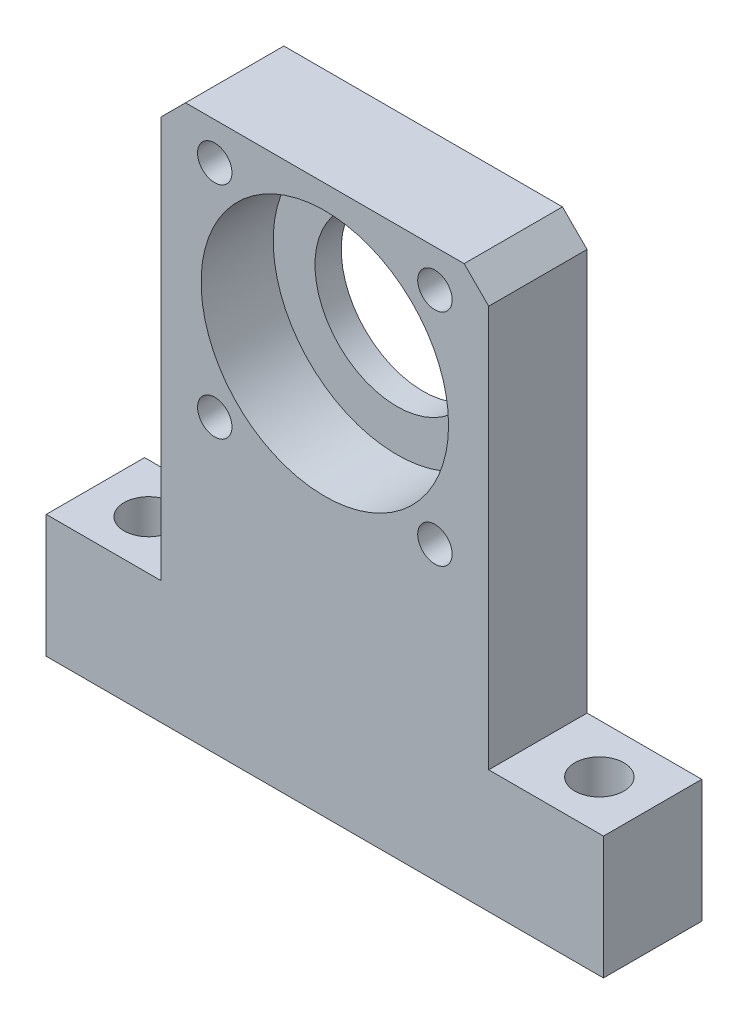
ISO-10303-21;
HEADER;
FILE_DESCRIPTION(('STEP AP214'),'2;1');
FILE_NAME('part.step','',(''),(''),'','','');
FILE_SCHEMA(('AUTOMOTIVE_DESIGN { 1 0 10303 214 1 1 1 1 }'));
ENDSEC;
DATA;
#1=APPLICATION_CONTEXT('core data for automotive mechanical design processes');
#2=APPLICATION_PROTOCOL_DEFINITION('international standard','automotive_design',2000,#1);
#3=PRODUCT_CONTEXT('',#1,'mechanical');
#4=PRODUCT('Part','Part','',(#3));
#5=PRODUCT_RELATED_PRODUCT_CATEGORY('part','',(#4));
#6=PRODUCT_DEFINITION_FORMATION('','',#4);
#7=PRODUCT_DEFINITION_CONTEXT('part definition',#1,'design');
#8=PRODUCT_DEFINITION('design','',#6,#7);
#9=PRODUCT_DEFINITION_SHAPE('','',#8);
#10=(LENGTH_UNIT() NAMED_UNIT(*) SI_UNIT(.MILLI.,.METRE.));
#11=(NAMED_UNIT(*) PLANE_ANGLE_UNIT() SI_UNIT($,.RADIAN.));
#12=(NAMED_UNIT(*) SI_UNIT($,.STERADIAN.) SOLID_ANGLE_UNIT());
#13=UNCERTAINTY_MEASURE_WITH_UNIT(LENGTH_MEASURE(1.E-05),#10,'distance_accuracy_value','');
#14=(GEOMETRIC_REPRESENTATION_CONTEXT(3) GLOBAL_UNCERTAINTY_ASSIGNED_CONTEXT((#13)) GLOBAL_UNIT_ASSIGNED_CONTEXT((#10,
#11,#12)) REPRESENTATION_CONTEXT('',''));
#15=CARTESIAN_POINT('',(0.,0.,0.));
#16=DIRECTION('',(0.,0.,1.));
#17=DIRECTION('',(1.,0.,0.));
#18=AXIS2_PLACEMENT_3D('',#15,#16,#17);
#19=CARTESIAN_POINT('',(0.,0.,12.));
#20=DIRECTION('',(1.,0.,0.));
#21=DIRECTION('',(0.,0.,-1.));
#22=AXIS2_PLACEMENT_3D('',#19,#20,#21);
#23=PLANE('',#22);
#24=DIRECTION('',(0.,-1.,0.));
#25=VECTOR('',#24,1.);
#26=CARTESIAN_POINT('',(0.,0.,12.));
#27=LINE('',#26,#25);
#28=CARTESIAN_POINT('',(0.,15.,12.));
#29=VERTEX_POINT('',#28);
#30=CARTESIAN_POINT('',(0.,0.,12.));
#31=VERTEX_POINT('',#30);
#32=EDGE_CURVE('E142',#29,#31,#27,.T.);
#33=ORIENTED_EDGE('',*,*,#32,.F.);
#34=DIRECTION('',(0.,0.,1.));
#35=VECTOR('',#34,1.);
#36=CARTESIAN_POINT('',(0.,15.,0.));
#37=LINE('',#36,#35);
#38=CARTESIAN_POINT('',(0.,15.,0.));
#39=VERTEX_POINT('',#38);
#40=EDGE_CURVE('E190',#39,#29,#37,.T.);
#41=ORIENTED_EDGE('',*,*,#40,.F.);
#42=DIRECTION('',(0.,-1.,0.));
#43=VECTOR('',#42,1.);
#44=CARTESIAN_POINT('',(0.,0.,0.));
#45=LINE('',#44,#43);
#46=CARTESIAN_POINT('',(0.,0.,0.));
#47=VERTEX_POINT('',#46);
#48=EDGE_CURVE('E144',#39,#47,#45,.T.);
#49=ORIENTED_EDGE('',*,*,#48,.T.);
#50=DIRECTION('',(0.,0.,-1.));
#51=VECTOR('',#50,1.);
#52=CARTESIAN_POINT('',(0.,0.,12.));
#53=LINE('',#52,#51);
#54=EDGE_CURVE('E149',#31,#47,#53,.T.);
#55=ORIENTED_EDGE('',*,*,#54,.F.);
#56=EDGE_LOOP('',(#33,#41,#49,#55));
#57=FACE_BOUND('',#56,.T.);
#58=ADVANCED_FACE('F33',(#57),#23,.F.);
#59=CARTESIAN_POINT('',(0.,0.,12.));
#60=DIRECTION('',(0.,1.,0.));
#61=DIRECTION('',(0.,0.,1.));
#62=AXIS2_PLACEMENT_3D('',#59,#60,#61);
#63=PLANE('',#62);
#64=CARTESIAN_POINT('',(61.5,0.,6.00000000000001));
#65=DIRECTION('',(0.,-1.,0.));
#66=DIRECTION('',(0.,0.,1.));
#67=AXIS2_PLACEMENT_3D('',#64,#65,#66);
#68=CIRCLE('',#67,3.);
#69=CARTESIAN_POINT('',(61.5,0.,9.00000000000001));
#70=VERTEX_POINT('',#69);
#71=EDGE_CURVE('E178',#70,#70,#68,.T.);
#72=ORIENTED_EDGE('',*,*,#71,.F.);
#73=EDGE_LOOP('',(#72));
#74=FACE_BOUND('',#73,.T.);
#75=CARTESIAN_POINT('',(6.5,0.,6.));
#76=DIRECTION('',(0.,-1.,0.));
#77=DIRECTION('',(0.,0.,-1.));
#78=AXIS2_PLACEMENT_3D('',#75,#76,#77);
#79=CIRCLE('',#78,3.);
#80=CARTESIAN_POINT('',(6.5,0.,3.));
#81=VERTEX_POINT('',#80);
#82=EDGE_CURVE('E169',#81,#81,#79,.T.);
#83=ORIENTED_EDGE('',*,*,#82,.F.);
#84=EDGE_LOOP('',(#83));
#85=FACE_BOUND('',#84,.T.);
#86=DIRECTION('',(1.,0.,0.));
#87=VECTOR('',#86,1.);
#88=CARTESIAN_POINT('',(0.,0.,0.));
#89=LINE('',#88,#87);
#90=CARTESIAN_POINT('',(68.,0.,0.));
#91=VERTEX_POINT('',#90);
#92=EDGE_CURVE('E140',#47,#91,#89,.T.);
#93=ORIENTED_EDGE('',*,*,#92,.T.);
#94=DIRECTION('',(0.,0.,-1.));
#95=VECTOR('',#94,1.);
#96=CARTESIAN_POINT('',(68.,0.,12.));
#97=LINE('',#96,#95);
#98=CARTESIAN_POINT('',(68.,0.,12.));
#99=VERTEX_POINT('',#98);
#100=EDGE_CURVE('E138',#99,#91,#97,.T.);
#101=ORIENTED_EDGE('',*,*,#100,.F.);
#102=DIRECTION('',(1.,0.,0.));
#103=VECTOR('',#102,1.);
#104=CARTESIAN_POINT('',(0.,0.,12.));
#105=LINE('',#104,#103);
#106=EDGE_CURVE('E234',#31,#99,#105,.T.);
#107=ORIENTED_EDGE('',*,*,#106,.F.);
#108=ORIENTED_EDGE('',*,*,#54,.T.);
#109=EDGE_LOOP('',(#93,#101,#107,#108));
#110=FACE_BOUND('',#109,.T.);
#111=ADVANCED_FACE('F246',(#74,#85,#110),#63,.F.);
#112=CARTESIAN_POINT('',(68.,0.,12.));
#113=DIRECTION('',(-1.,0.,0.));
#114=DIRECTION('',(0.,0.,1.));
#115=AXIS2_PLACEMENT_3D('',#112,#113,#114);
#116=PLANE('',#115);
#117=DIRECTION('',(0.,1.,0.));
#118=VECTOR('',#117,1.);
#119=CARTESIAN_POINT('',(68.,0.,0.));
#120=LINE('',#119,#118);
#121=CARTESIAN_POINT('',(68.,15.,0.));
#122=VERTEX_POINT('',#121);
#123=EDGE_CURVE('E131',#91,#122,#120,.T.);
#124=ORIENTED_EDGE('',*,*,#123,.T.);
#125=DIRECTION('',(0.,0.,1.));
#126=VECTOR('',#125,1.);
#127=CARTESIAN_POINT('',(68.,15.,0.));
#128=LINE('',#127,#126);
#129=CARTESIAN_POINT('',(68.,15.,12.));
#130=VERTEX_POINT('',#129);
#131=EDGE_CURVE('E112',#122,#130,#128,.T.);
#132=ORIENTED_EDGE('',*,*,#131,.T.);
#133=DIRECTION('',(0.,1.,0.));
#134=VECTOR('',#133,1.);
#135=CARTESIAN_POINT('',(68.,0.,12.));
#136=LINE('',#135,#134);
#137=EDGE_CURVE('E236',#99,#130,#136,.T.);
#138=ORIENTED_EDGE('',*,*,#137,.F.);
#139=ORIENTED_EDGE('',*,*,#100,.T.);
#140=EDGE_LOOP('',(#124,#132,#138,#139));
#141=FACE_BOUND('',#140,.T.);
#142=ADVANCED_FACE('F136',(#141),#116,.F.);
#143=CARTESIAN_POINT('',(0.,67.,12.));
#144=DIRECTION('',(0.,-1.,0.));
#145=DIRECTION('',(0.,0.,-1.));
#146=AXIS2_PLACEMENT_3D('',#143,#144,#145);
#147=PLANE('',#146);
#148=DIRECTION('',(-1.,0.,0.));
#149=VECTOR('',#148,1.);
#150=CARTESIAN_POINT('',(0.,67.,12.));
#151=LINE('',#150,#149);
#152=CARTESIAN_POINT('',(51.,67.,12.));
#153=VERTEX_POINT('',#152);
#154=CARTESIAN_POINT('',(17.,67.,12.));
#155=VERTEX_POINT('',#154);
#156=EDGE_CURVE('E150',#153,#155,#151,.T.);
#157=ORIENTED_EDGE('',*,*,#156,.F.);
#158=DIRECTION('',(0.,0.,-1.));
#159=VECTOR('',#158,1.);
#160=CARTESIAN_POINT('',(51.,67.,12.));
#161=LINE('',#160,#159);
#162=CARTESIAN_POINT('',(51.,67.,0.));
#163=VERTEX_POINT('',#162);
#164=EDGE_CURVE('E163',#153,#163,#161,.T.);
#165=ORIENTED_EDGE('',*,*,#164,.T.);
#166=DIRECTION('',(-1.,0.,0.));
#167=VECTOR('',#166,1.);
#168=CARTESIAN_POINT('',(0.,67.,0.));
#169=LINE('',#168,#167);
#170=CARTESIAN_POINT('',(17.,67.,0.));
#171=VERTEX_POINT('',#170);
#172=EDGE_CURVE('E139',#163,#171,#169,.T.);
#173=ORIENTED_EDGE('',*,*,#172,.T.);
#174=DIRECTION('',(0.,0.,1.));
#175=VECTOR('',#174,1.);
#176=CARTESIAN_POINT('',(17.,67.,12.));
#177=LINE('',#176,#175);
#178=EDGE_CURVE('E160',#171,#155,#177,.T.);
#179=ORIENTED_EDGE('',*,*,#178,.T.);
#180=EDGE_LOOP('',(#157,#165,#173,#179));
#181=FACE_BOUND('',#180,.T.);
#182=ADVANCED_FACE('F259',(#181),#147,.F.);
#183=CARTESIAN_POINT('',(0.,67.,12.));
#184=DIRECTION('',(0.,0.,-1.));
#185=DIRECTION('',(-1.,0.,0.));
#186=AXIS2_PLACEMENT_3D('',#183,#184,#185);
#187=PLANE('',#186);
#188=CARTESIAN_POINT('',(47.4350288425444,62.4350288425444,12.));
#189=DIRECTION('',(0.,0.,1.));
#190=DIRECTION('',(1.,0.,0.));
#191=AXIS2_PLACEMENT_3D('',#188,#189,#190);
#192=CIRCLE('',#191,2.09999999999999);
#193=CARTESIAN_POINT('',(49.5350288425444,62.4350288425444,12.));
#194=VERTEX_POINT('',#193);
#195=EDGE_CURVE('E196',#194,#194,#192,.T.);
#196=ORIENTED_EDGE('',*,*,#195,.F.);
#197=EDGE_LOOP('',(#196));
#198=FACE_BOUND('',#197,.T.);
#199=CARTESIAN_POINT('',(20.5649711574556,62.4350288425444,12.));
#200=DIRECTION('',(0.,0.,1.));
#201=DIRECTION('',(1.,0.,0.));
#202=AXIS2_PLACEMENT_3D('',#199,#200,#201);
#203=CIRCLE('',#202,2.09999999999999);
#204=CARTESIAN_POINT('',(22.6649711574556,62.4350288425444,12.));
#205=VERTEX_POINT('',#204);
#206=EDGE_CURVE('E203',#205,#205,#203,.T.);
#207=ORIENTED_EDGE('',*,*,#206,.F.);
#208=EDGE_LOOP('',(#207));
#209=FACE_BOUND('',#208,.T.);
#210=CARTESIAN_POINT('',(20.5649711574556,35.5649711574556,12.));
#211=DIRECTION('',(0.,0.,1.));
#212=DIRECTION('',(1.,0.,0.));
#213=AXIS2_PLACEMENT_3D('',#210,#211,#212);
#214=CIRCLE('',#213,2.09999999999999);
#215=CARTESIAN_POINT('',(22.6649711574556,35.5649711574556,12.));
#216=VERTEX_POINT('',#215);
#217=EDGE_CURVE('E209',#216,#216,#214,.T.);
#218=ORIENTED_EDGE('',*,*,#217,.F.);
#219=EDGE_LOOP('',(#218));
#220=FACE_BOUND('',#219,.T.);
#221=CARTESIAN_POINT('',(47.4350288425444,35.5649711574556,12.));
#222=DIRECTION('',(0.,0.,1.));
#223=DIRECTION('',(1.,0.,0.));
#224=AXIS2_PLACEMENT_3D('',#221,#222,#223);
#225=CIRCLE('',#224,2.09999999999999);
#226=CARTESIAN_POINT('',(49.5350288425444,35.5649711574556,12.));
#227=VERTEX_POINT('',#226);
#228=EDGE_CURVE('E215',#227,#227,#225,.T.);
#229=ORIENTED_EDGE('',*,*,#228,.F.);
#230=EDGE_LOOP('',(#229));
#231=FACE_BOUND('',#230,.T.);
#232=CARTESIAN_POINT('',(34.,49.,12.));
#233=DIRECTION('',(0.,0.,1.));
#234=DIRECTION('',(1.,0.,0.));
#235=AXIS2_PLACEMENT_3D('',#232,#233,#234);
#236=CIRCLE('',#235,15.1);
#237=CARTESIAN_POINT('',(49.1,49.,12.));
#238=VERTEX_POINT('',#237);
#239=EDGE_CURVE('E225',#238,#238,#236,.T.);
#240=ORIENTED_EDGE('',*,*,#239,.F.);
#241=EDGE_LOOP('',(#240));
#242=FACE_BOUND('',#241,.T.);
#243=DIRECTION('',(0.,-1.,0.));
#244=VECTOR('',#243,1.);
#245=CARTESIAN_POINT('',(54.,67.,12.));
#246=LINE('',#245,#244);
#247=CARTESIAN_POINT('',(54.,64.,12.));
#248=VERTEX_POINT('',#247);
#249=CARTESIAN_POINT('',(54.,15.,12.));
#250=VERTEX_POINT('',#249);
#251=EDGE_CURVE('E168',#248,#250,#246,.T.);
#252=ORIENTED_EDGE('',*,*,#251,.F.);
#253=DIRECTION('',(0.707106781186549,-0.707106781186546,0.));
#254=VECTOR('',#253,1.);
#255=CARTESIAN_POINT('',(54.,64.,12.));
#256=LINE('',#255,#254);
#257=EDGE_CURVE('E158',#248,#153,#256,.F.);
#258=ORIENTED_EDGE('',*,*,#257,.T.);
#259=ORIENTED_EDGE('',*,*,#156,.T.);
#260=DIRECTION('',(0.707106781186546,0.707106781186549,0.));
#261=VECTOR('',#260,1.);
#262=CARTESIAN_POINT('',(17.,67.,12.));
#263=LINE('',#262,#261);
#264=CARTESIAN_POINT('',(14.,64.,12.));
#265=VERTEX_POINT('',#264);
#266=EDGE_CURVE('E156',#155,#265,#263,.F.);
#267=ORIENTED_EDGE('',*,*,#266,.T.);
#268=DIRECTION('',(0.,1.,0.));
#269=VECTOR('',#268,1.);
#270=CARTESIAN_POINT('',(14.,67.,12.));
#271=LINE('',#270,#269);
#272=CARTESIAN_POINT('',(14.,15.,12.));
#273=VERTEX_POINT('',#272);
#274=EDGE_CURVE('E188',#273,#265,#271,.T.);
#275=ORIENTED_EDGE('',*,*,#274,.F.);
#276=DIRECTION('',(1.,0.,0.));
#277=VECTOR('',#276,1.);
#278=CARTESIAN_POINT('',(0.,15.,12.));
#279=LINE('',#278,#277);
#280=EDGE_CURVE('E124',#29,#273,#279,.T.);
#281=ORIENTED_EDGE('',*,*,#280,.F.);
#282=ORIENTED_EDGE('',*,*,#32,.T.);
#283=ORIENTED_EDGE('',*,*,#106,.T.);
#284=ORIENTED_EDGE('',*,*,#137,.T.);
#285=DIRECTION('',(1.,0.,0.));
#286=VECTOR('',#285,1.);
#287=CARTESIAN_POINT('',(68.,15.,12.));
#288=LINE('',#287,#286);
#289=EDGE_CURVE('E119',#250,#130,#288,.T.);
#290=ORIENTED_EDGE('',*,*,#289,.F.);
#291=EDGE_LOOP('',(#252,#258,#259,#267,#275,#281,#282,#283,#284,#290));
#292=FACE_BOUND('',#291,.T.);
#293=ADVANCED_FACE('F249',(#198,#209,#220,#231,#242,#292),#187,.F.);
#294=CARTESIAN_POINT('',(0.,67.,0.));
#295=DIRECTION('',(0.,0.,-1.));
#296=DIRECTION('',(-1.,0.,0.));
#297=AXIS2_PLACEMENT_3D('',#294,#295,#296);
#298=PLANE('',#297);
#299=ORIENTED_EDGE('',*,*,#172,.F.);
#300=DIRECTION('',(-0.707106781186549,0.707106781186546,0.));
#301=VECTOR('',#300,1.);
#302=CARTESIAN_POINT('',(25.4999999999999,92.5,0.));
#303=LINE('',#302,#301);
#304=CARTESIAN_POINT('',(54.,64.,0.));
#305=VERTEX_POINT('',#304);
#306=EDGE_CURVE('E42',#163,#305,#303,.F.);
#307=ORIENTED_EDGE('',*,*,#306,.T.);
#308=DIRECTION('',(0.,-1.,0.));
#309=VECTOR('',#308,1.);
#310=CARTESIAN_POINT('',(54.,67.,0.));
#311=LINE('',#310,#309);
#312=CARTESIAN_POINT('',(54.,15.,0.));
#313=VERTEX_POINT('',#312);
#314=EDGE_CURVE('E133',#305,#313,#311,.T.);
#315=ORIENTED_EDGE('',*,*,#314,.T.);
#316=DIRECTION('',(1.,0.,0.));
#317=VECTOR('',#316,1.);
#318=CARTESIAN_POINT('',(68.,15.,0.));
#319=LINE('',#318,#317);
#320=EDGE_CURVE('E116',#313,#122,#319,.T.);
#321=ORIENTED_EDGE('',*,*,#320,.T.);
#322=ORIENTED_EDGE('',*,*,#123,.F.);
#323=ORIENTED_EDGE('',*,*,#92,.F.);
#324=ORIENTED_EDGE('',*,*,#48,.F.);
#325=DIRECTION('',(1.,0.,0.));
#326=VECTOR('',#325,1.);
#327=CARTESIAN_POINT('',(0.,15.,0.));
#328=LINE('',#327,#326);
#329=CARTESIAN_POINT('',(14.,15.,0.));
#330=VERTEX_POINT('',#329);
#331=EDGE_CURVE('E184',#39,#330,#328,.T.);
#332=ORIENTED_EDGE('',*,*,#331,.T.);
#333=DIRECTION('',(0.,1.,0.));
#334=VECTOR('',#333,1.);
#335=CARTESIAN_POINT('',(14.,67.,0.));
#336=LINE('',#335,#334);
#337=CARTESIAN_POINT('',(14.,64.,0.));
#338=VERTEX_POINT('',#337);
#339=EDGE_CURVE('E187',#330,#338,#336,.T.);
#340=ORIENTED_EDGE('',*,*,#339,.T.);
#341=DIRECTION('',(-0.707106781186546,-0.707106781186549,0.));
#342=VECTOR('',#341,1.);
#343=CARTESIAN_POINT('',(8.50000000000004,58.5,0.));
#344=LINE('',#343,#342);
#345=EDGE_CURVE('E55',#338,#171,#344,.F.);
#346=ORIENTED_EDGE('',*,*,#345,.T.);
#347=EDGE_LOOP('',(#299,#307,#315,#321,#322,#323,#324,#332,#340,#346));
#348=FACE_BOUND('',#347,.T.);
#349=CARTESIAN_POINT('',(47.4350288425444,62.4350288425444,0.));
#350=DIRECTION('',(0.,0.,1.));
#351=DIRECTION('',(1.,0.,0.));
#352=AXIS2_PLACEMENT_3D('',#349,#350,#351);
#353=CIRCLE('',#352,2.1);
#354=CARTESIAN_POINT('',(49.5350288425444,62.4350288425444,0.));
#355=VERTEX_POINT('',#354);
#356=EDGE_CURVE('E200',#355,#355,#353,.T.);
#357=ORIENTED_EDGE('',*,*,#356,.T.);
#358=EDGE_LOOP('',(#357));
#359=FACE_BOUND('',#358,.T.);
#360=CARTESIAN_POINT('',(20.5649711574556,62.4350288425444,0.));
#361=DIRECTION('',(0.,0.,1.));
#362=DIRECTION('',(1.,0.,0.));
#363=AXIS2_PLACEMENT_3D('',#360,#361,#362);
#364=CIRCLE('',#363,2.1);
#365=CARTESIAN_POINT('',(22.6649711574556,62.4350288425444,0.));
#366=VERTEX_POINT('',#365);
#367=EDGE_CURVE('E206',#366,#366,#364,.T.);
#368=ORIENTED_EDGE('',*,*,#367,.T.);
#369=EDGE_LOOP('',(#368));
#370=FACE_BOUND('',#369,.T.);
#371=CARTESIAN_POINT('',(20.5649711574556,35.5649711574556,0.));
#372=DIRECTION('',(0.,0.,1.));
#373=DIRECTION('',(1.,0.,0.));
#374=AXIS2_PLACEMENT_3D('',#371,#372,#373);
#375=CIRCLE('',#374,2.1);
#376=CARTESIAN_POINT('',(22.6649711574556,35.5649711574556,0.));
#377=VERTEX_POINT('',#376);
#378=EDGE_CURVE('E212',#377,#377,#375,.T.);
#379=ORIENTED_EDGE('',*,*,#378,.T.);
#380=EDGE_LOOP('',(#379));
#381=FACE_BOUND('',#380,.T.);
#382=CARTESIAN_POINT('',(47.4350288425444,35.5649711574556,0.));
#383=DIRECTION('',(0.,0.,1.));
#384=DIRECTION('',(1.,0.,0.));
#385=AXIS2_PLACEMENT_3D('',#382,#383,#384);
#386=CIRCLE('',#385,2.1);
#387=CARTESIAN_POINT('',(49.5350288425444,35.5649711574556,0.));
#388=VERTEX_POINT('',#387);
#389=EDGE_CURVE('E218',#388,#388,#386,.T.);
#390=ORIENTED_EDGE('',*,*,#389,.T.);
#391=EDGE_LOOP('',(#390));
#392=FACE_BOUND('',#391,.T.);
#393=CARTESIAN_POINT('',(34.,49.,0.));
#394=DIRECTION('',(0.,0.,1.));
#395=DIRECTION('',(1.,0.,0.));
#396=AXIS2_PLACEMENT_3D('',#393,#394,#395);
#397=CIRCLE('',#396,10.);
#398=CARTESIAN_POINT('',(44.,49.,0.));
#399=VERTEX_POINT('',#398);
#400=EDGE_CURVE('E222',#399,#399,#397,.T.);
#401=ORIENTED_EDGE('',*,*,#400,.T.);
#402=EDGE_LOOP('',(#401));
#403=FACE_BOUND('',#402,.T.);
#404=ADVANCED_FACE('F128',(#348,#359,#370,#381,#392,#403),#298,.T.);
#405=CARTESIAN_POINT('',(34.,49.,3.2));
#406=DIRECTION('',(0.,0.,1.));
#407=DIRECTION('',(1.,0.,0.));
#408=AXIS2_PLACEMENT_3D('',#405,#406,#407);
#409=CYLINDRICAL_SURFACE('',#408,15.1);
#410=CARTESIAN_POINT('',(34.,49.,3.2));
#411=DIRECTION('',(0.,0.,1.));
#412=DIRECTION('',(1.,0.,0.));
#413=AXIS2_PLACEMENT_3D('',#410,#411,#412);
#414=CIRCLE('',#413,15.1);
#415=CARTESIAN_POINT('',(49.1,49.,3.2));
#416=VERTEX_POINT('',#415);
#417=EDGE_CURVE('E228',#416,#416,#414,.T.);
#418=ORIENTED_EDGE('',*,*,#417,.F.);
#419=EDGE_LOOP('',(#418));
#420=FACE_BOUND('',#419,.T.);
#421=ORIENTED_EDGE('',*,*,#239,.T.);
#422=EDGE_LOOP('',(#421));
#423=FACE_BOUND('',#422,.T.);
#424=ADVANCED_FACE('F290',(#420,#423),#409,.F.);
#425=CARTESIAN_POINT('',(34.,49.,3.2));
#426=DIRECTION('',(0.,0.,1.));
#427=DIRECTION('',(1.,0.,0.));
#428=AXIS2_PLACEMENT_3D('',#425,#426,#427);
#429=PLANE('',#428);
#430=CARTESIAN_POINT('',(34.,49.,3.2));
#431=DIRECTION('',(0.,0.,1.));
#432=DIRECTION('',(1.,0.,0.));
#433=AXIS2_PLACEMENT_3D('',#430,#431,#432);
#434=CIRCLE('',#433,10.);
#435=CARTESIAN_POINT('',(44.,49.,3.2));
#436=VERTEX_POINT('',#435);
#437=EDGE_CURVE('E221',#436,#436,#434,.T.);
#438=ORIENTED_EDGE('',*,*,#437,.F.);
#439=EDGE_LOOP('',(#438));
#440=FACE_BOUND('',#439,.T.);
#441=ORIENTED_EDGE('',*,*,#417,.T.);
#442=EDGE_LOOP('',(#441));
#443=FACE_BOUND('',#442,.T.);
#444=ADVANCED_FACE('F296',(#440,#443),#429,.T.);
#445=CARTESIAN_POINT('',(34.,49.,0.));
#446=DIRECTION('',(0.,0.,1.));
#447=DIRECTION('',(1.,0.,0.));
#448=AXIS2_PLACEMENT_3D('',#445,#446,#447);
#449=CYLINDRICAL_SURFACE('',#448,10.);
#450=CARTESIAN_POINT('',(44.,49.,0.));
#451=CARTESIAN_POINT('',(44.,49.,0.0333333333333333));
#452=CARTESIAN_POINT('',(44.,49.,0.0666666666666666));
#453=CARTESIAN_POINT('',(44.,49.,0.133333333333333));
#454=CARTESIAN_POINT('',(44.,49.,0.166666666666667));
#455=CARTESIAN_POINT('',(44.,49.,0.233333333333333));
#456=CARTESIAN_POINT('',(44.,49.,0.266666666666667));
#457=CARTESIAN_POINT('',(44.,49.,0.333333333333333));
#458=CARTESIAN_POINT('',(44.,49.,0.366666666666667));
#459=CARTESIAN_POINT('',(44.,49.,0.433333333333333));
#460=CARTESIAN_POINT('',(44.,49.,0.466666666666667));
#461=CARTESIAN_POINT('',(44.,49.,0.533333333333333));
#462=CARTESIAN_POINT('',(44.,49.,0.566666666666667));
#463=CARTESIAN_POINT('',(44.,49.,0.633333333333333));
#464=CARTESIAN_POINT('',(44.,49.,0.666666666666666));
#465=CARTESIAN_POINT('',(44.,49.,0.733333333333333));
#466=CARTESIAN_POINT('',(44.,49.,0.766666666666666));
#467=CARTESIAN_POINT('',(44.,49.,0.833333333333333));
#468=CARTESIAN_POINT('',(44.,49.,0.866666666666666));
#469=CARTESIAN_POINT('',(44.,49.,0.933333333333333));
#470=CARTESIAN_POINT('',(44.,49.,0.966666666666666));
#471=CARTESIAN_POINT('',(44.,49.,1.03333333333333));
#472=CARTESIAN_POINT('',(44.,49.,1.06666666666667));
#473=CARTESIAN_POINT('',(44.,49.,1.13333333333333));
#474=CARTESIAN_POINT('',(44.,49.,1.16666666666667));
#475=CARTESIAN_POINT('',(44.,49.,1.23333333333333));
#476=CARTESIAN_POINT('',(44.,49.,1.26666666666667));
#477=CARTESIAN_POINT('',(44.,49.,1.33333333333333));
#478=CARTESIAN_POINT('',(44.,49.,1.36666666666667));
#479=CARTESIAN_POINT('',(44.,49.,1.43333333333333));
#480=CARTESIAN_POINT('',(44.,49.,1.46666666666667));
#481=CARTESIAN_POINT('',(44.,49.,1.53333333333333));
#482=CARTESIAN_POINT('',(44.,49.,1.56666666666667));
#483=CARTESIAN_POINT('',(44.,49.,1.63333333333333));
#484=CARTESIAN_POINT('',(44.,49.,1.66666666666667));
#485=CARTESIAN_POINT('',(44.,49.,1.73333333333333));
#486=CARTESIAN_POINT('',(44.,49.,1.76666666666667));
#487=CARTESIAN_POINT('',(44.,49.,1.83333333333333));
#488=CARTESIAN_POINT('',(44.,49.,1.86666666666667));
#489=CARTESIAN_POINT('',(44.,49.,1.93333333333333));
#490=CARTESIAN_POINT('',(44.,49.,1.96666666666667));
#491=CARTESIAN_POINT('',(44.,49.,2.03333333333333));
#492=CARTESIAN_POINT('',(44.,49.,2.06666666666667));
#493=CARTESIAN_POINT('',(44.,49.,2.13333333333333));
#494=CARTESIAN_POINT('',(44.,49.,2.16666666666667));
#495=CARTESIAN_POINT('',(44.,49.,2.23333333333333));
#496=CARTESIAN_POINT('',(44.,49.,2.26666666666667));
#497=CARTESIAN_POINT('',(44.,49.,2.33333333333333));
#498=CARTESIAN_POINT('',(44.,49.,2.36666666666667));
#499=CARTESIAN_POINT('',(44.,49.,2.43333333333333));
#500=CARTESIAN_POINT('',(44.,49.,2.46666666666667));
#501=CARTESIAN_POINT('',(44.,49.,2.53333333333333));
#502=CARTESIAN_POINT('',(44.,49.,2.56666666666667));
#503=CARTESIAN_POINT('',(44.,49.,2.63333333333333));
#504=CARTESIAN_POINT('',(44.,49.,2.66666666666667));
#505=CARTESIAN_POINT('',(44.,49.,2.73333333333333));
#506=CARTESIAN_POINT('',(44.,49.,2.76666666666667));
#507=CARTESIAN_POINT('',(44.,49.,2.83333333333333));
#508=CARTESIAN_POINT('',(44.,49.,2.86666666666667));
#509=CARTESIAN_POINT('',(44.,49.,2.93333333333333));
#510=CARTESIAN_POINT('',(44.,49.,2.96666666666667));
#511=CARTESIAN_POINT('',(44.,49.,3.03333333333333));
#512=CARTESIAN_POINT('',(44.,49.,3.06666666666667));
#513=CARTESIAN_POINT('',(44.,49.,3.13333333333333));
#514=CARTESIAN_POINT('',(44.,49.,3.16666666666667));
#515=CARTESIAN_POINT('',(44.,49.,3.2));
#516=B_SPLINE_CURVE_WITH_KNOTS('',3,(#450,#451,#452,#453,#454,#455,#456,#457,#458,#459,#460,
#461,#462,#463,#464,#465,#466,#467,#468,#469,#470,#471,#472,#473,#474,#475,#476,#477,#478,#479,
#480,#481,#482,#483,#484,#485,#486,#487,#488,#489,#490,#491,#492,#493,#494,#495,#496,#497,#498,
#499,#500,#501,#502,#503,#504,#505,#506,#507,#508,#509,#510,#511,#512,#513,#514,#515),
.UNSPECIFIED.,.F.,.F.,(4,2,2,2,2,2,2,2,2,2,2,2,2,2,2,2,2,2,2,2,2,2,2,2,2,2,2,2,2,2,2,2,4),(0.,
0.1,0.2,0.3,0.4,0.5,0.6,0.7,0.8,0.9,1.,1.1,1.2,1.3,1.4,1.5,1.6,1.7,1.8,1.9,2.,2.1,2.2,2.3,2.4,
2.5,2.6,2.7,2.8,2.9,3.,3.1,3.2),.UNSPECIFIED.);
#517=EDGE_CURVE('BSEAM300',#399,#436,#516,.T.);
#518=ORIENTED_EDGE('',*,*,#400,.F.);
#519=ORIENTED_EDGE('',*,*,#437,.T.);
#520=ORIENTED_EDGE('',*,*,#517,.T.);
#521=ORIENTED_EDGE('',*,*,#517,.F.);
#522=EDGE_LOOP('',(#518,#520,#519,#521));
#523=FACE_BOUND('',#522,.T.);
#524=ADVANCED_FACE('F300',(#523),#449,.F.);
#525=CARTESIAN_POINT('',(47.4350288425444,35.5649711574556,12.));
#526=DIRECTION('',(0.,0.,1.));
#527=DIRECTION('',(1.,0.,0.));
#528=AXIS2_PLACEMENT_3D('',#525,#526,#527);
#529=CYLINDRICAL_SURFACE('',#528,2.09999999999999);
#530=ORIENTED_EDGE('',*,*,#389,.F.);
#531=EDGE_LOOP('',(#530));
#532=FACE_BOUND('',#531,.T.);
#533=ORIENTED_EDGE('',*,*,#228,.T.);
#534=EDGE_LOOP('',(#533));
#535=FACE_BOUND('',#534,.T.);
#536=ADVANCED_FACE('F304',(#532,#535),#529,.F.);
#537=CARTESIAN_POINT('',(20.5649711574556,35.5649711574556,12.));
#538=DIRECTION('',(0.,0.,1.));
#539=DIRECTION('',(1.,0.,0.));
#540=AXIS2_PLACEMENT_3D('',#537,#538,#539);
#541=CYLINDRICAL_SURFACE('',#540,2.09999999999999);
#542=ORIENTED_EDGE('',*,*,#378,.F.);
#543=EDGE_LOOP('',(#542));
#544=FACE_BOUND('',#543,.T.);
#545=ORIENTED_EDGE('',*,*,#217,.T.);
#546=EDGE_LOOP('',(#545));
#547=FACE_BOUND('',#546,.T.);
#548=ADVANCED_FACE('F308',(#544,#547),#541,.F.);
#549=CARTESIAN_POINT('',(20.5649711574556,62.4350288425444,12.));
#550=DIRECTION('',(0.,0.,1.));
#551=DIRECTION('',(1.,0.,0.));
#552=AXIS2_PLACEMENT_3D('',#549,#550,#551);
#553=CYLINDRICAL_SURFACE('',#552,2.09999999999999);
#554=ORIENTED_EDGE('',*,*,#367,.F.);
#555=EDGE_LOOP('',(#554));
#556=FACE_BOUND('',#555,.T.);
#557=ORIENTED_EDGE('',*,*,#206,.T.);
#558=EDGE_LOOP('',(#557));
#559=FACE_BOUND('',#558,.T.);
#560=ADVANCED_FACE('F312',(#556,#559),#553,.F.);
#561=CARTESIAN_POINT('',(47.4350288425444,62.4350288425444,12.));
#562=DIRECTION('',(0.,0.,1.));
#563=DIRECTION('',(1.,0.,0.));
#564=AXIS2_PLACEMENT_3D('',#561,#562,#563);
#565=CYLINDRICAL_SURFACE('',#564,2.09999999999999);
#566=ORIENTED_EDGE('',*,*,#356,.F.);
#567=EDGE_LOOP('',(#566));
#568=FACE_BOUND('',#567,.T.);
#569=ORIENTED_EDGE('',*,*,#195,.T.);
#570=EDGE_LOOP('',(#569));
#571=FACE_BOUND('',#570,.T.);
#572=ADVANCED_FACE('F316',(#568,#571),#565,.F.);
#573=CARTESIAN_POINT('',(14.,67.,0.));
#574=DIRECTION('',(1.,0.,0.));
#575=DIRECTION('',(0.,1.,0.));
#576=AXIS2_PLACEMENT_3D('',#573,#574,#575);
#577=PLANE('',#576);
#578=ORIENTED_EDGE('',*,*,#274,.T.);
#579=DIRECTION('',(0.,0.,-1.));
#580=VECTOR('',#579,1.);
#581=CARTESIAN_POINT('',(14.,64.,0.));
#582=LINE('',#581,#580);
#583=EDGE_CURVE('E11',#265,#338,#582,.T.);
#584=ORIENTED_EDGE('',*,*,#583,.T.);
#585=ORIENTED_EDGE('',*,*,#339,.F.);
#586=DIRECTION('',(0.,0.,1.));
#587=VECTOR('',#586,1.);
#588=CARTESIAN_POINT('',(14.,15.,0.));
#589=LINE('',#588,#587);
#590=EDGE_CURVE('E194',#330,#273,#589,.T.);
#591=ORIENTED_EDGE('',*,*,#590,.T.);
#592=EDGE_LOOP('',(#578,#584,#585,#591));
#593=FACE_BOUND('',#592,.T.);
#594=ADVANCED_FACE('F320',(#593),#577,.F.);
#595=CARTESIAN_POINT('',(0.,15.,0.));
#596=DIRECTION('',(0.,-1.,0.));
#597=DIRECTION('',(0.,0.,-1.));
#598=AXIS2_PLACEMENT_3D('',#595,#596,#597);
#599=PLANE('',#598);
#600=CARTESIAN_POINT('',(6.5,15.,6.));
#601=DIRECTION('',(0.,-1.,0.));
#602=DIRECTION('',(0.,0.,-1.));
#603=AXIS2_PLACEMENT_3D('',#600,#601,#602);
#604=CIRCLE('',#603,3.);
#605=CARTESIAN_POINT('',(6.5,15.,3.));
#606=VERTEX_POINT('',#605);
#607=EDGE_CURVE('E166',#606,#606,#604,.T.);
#608=ORIENTED_EDGE('',*,*,#607,.T.);
#609=EDGE_LOOP('',(#608));
#610=FACE_BOUND('',#609,.T.);
#611=ORIENTED_EDGE('',*,*,#280,.T.);
#612=ORIENTED_EDGE('',*,*,#590,.F.);
#613=ORIENTED_EDGE('',*,*,#331,.F.);
#614=ORIENTED_EDGE('',*,*,#40,.T.);
#615=EDGE_LOOP('',(#611,#612,#613,#614));
#616=FACE_BOUND('',#615,.T.);
#617=ADVANCED_FACE('F254',(#610,#616),#599,.F.);
#618=CARTESIAN_POINT('',(68.,15.,0.));
#619=DIRECTION('',(0.,-1.,0.));
#620=DIRECTION('',(0.,0.,-1.));
#621=AXIS2_PLACEMENT_3D('',#618,#619,#620);
#622=PLANE('',#621);
#623=CARTESIAN_POINT('',(61.5,15.,6.00000000000001));
#624=DIRECTION('',(0.,-1.,0.));
#625=DIRECTION('',(0.,0.,-1.));
#626=AXIS2_PLACEMENT_3D('',#623,#624,#625);
#627=CIRCLE('',#626,3.);
#628=CARTESIAN_POINT('',(61.5,15.,3.00000000000001));
#629=VERTEX_POINT('',#628);
#630=EDGE_CURVE('E37',#629,#629,#627,.T.);
#631=ORIENTED_EDGE('',*,*,#630,.T.);
#632=EDGE_LOOP('',(#631));
#633=FACE_BOUND('',#632,.T.);
#634=ORIENTED_EDGE('',*,*,#289,.T.);
#635=ORIENTED_EDGE('',*,*,#131,.F.);
#636=ORIENTED_EDGE('',*,*,#320,.F.);
#637=DIRECTION('',(0.,0.,1.));
#638=VECTOR('',#637,1.);
#639=CARTESIAN_POINT('',(54.,15.,0.));
#640=LINE('',#639,#638);
#641=EDGE_CURVE('E125',#313,#250,#640,.T.);
#642=ORIENTED_EDGE('',*,*,#641,.T.);
#643=EDGE_LOOP('',(#634,#635,#636,#642));
#644=FACE_BOUND('',#643,.T.);
#645=ADVANCED_FACE('F114',(#633,#644),#622,.F.);
#646=CARTESIAN_POINT('',(54.,67.,0.));
#647=DIRECTION('',(-1.,0.,0.));
#648=DIRECTION('',(0.,-1.,0.));
#649=AXIS2_PLACEMENT_3D('',#646,#647,#648);
#650=PLANE('',#649);
#651=ORIENTED_EDGE('',*,*,#314,.F.);
#652=DIRECTION('',(0.,0.,1.));
#653=VECTOR('',#652,1.);
#654=CARTESIAN_POINT('',(54.,64.,0.));
#655=LINE('',#654,#653);
#656=EDGE_CURVE('E153',#305,#248,#655,.T.);
#657=ORIENTED_EDGE('',*,*,#656,.T.);
#658=ORIENTED_EDGE('',*,*,#251,.T.);
#659=ORIENTED_EDGE('',*,*,#641,.F.);
#660=EDGE_LOOP('',(#651,#657,#658,#659));
#661=FACE_BOUND('',#660,.T.);
#662=ADVANCED_FACE('F266',(#661),#650,.F.);
#663=CARTESIAN_POINT('',(54.,64.,0.));
#664=DIRECTION('',(-0.707106781186546,-0.707106781186549,0.));
#665=DIRECTION('',(0.707106781186549,-0.707106781186546,0.));
#666=AXIS2_PLACEMENT_3D('',#663,#664,#665);
#667=PLANE('',#666);
#668=ORIENTED_EDGE('',*,*,#306,.F.);
#669=ORIENTED_EDGE('',*,*,#164,.F.);
#670=ORIENTED_EDGE('',*,*,#257,.F.);
#671=ORIENTED_EDGE('',*,*,#656,.F.);
#672=EDGE_LOOP('',(#668,#669,#670,#671));
#673=FACE_BOUND('',#672,.T.);
#674=ADVANCED_FACE('F264',(#673),#667,.F.);
#675=CARTESIAN_POINT('',(17.,67.,12.));
#676=DIRECTION('',(0.707106781186549,-0.707106781186546,0.));
#677=DIRECTION('',(0.707106781186546,0.707106781186549,0.));
#678=AXIS2_PLACEMENT_3D('',#675,#676,#677);
#679=PLANE('',#678);
#680=ORIENTED_EDGE('',*,*,#345,.F.);
#681=ORIENTED_EDGE('',*,*,#583,.F.);
#682=ORIENTED_EDGE('',*,*,#266,.F.);
#683=ORIENTED_EDGE('',*,*,#178,.F.);
#684=EDGE_LOOP('',(#680,#681,#682,#683));
#685=FACE_BOUND('',#684,.T.);
#686=ADVANCED_FACE('F35',(#685),#679,.F.);
#687=CARTESIAN_POINT('',(6.5,67.,6.));
#688=DIRECTION('',(0.,-1.,0.));
#689=DIRECTION('',(0.,0.,-1.));
#690=AXIS2_PLACEMENT_3D('',#687,#688,#689);
#691=CYLINDRICAL_SURFACE('',#690,3.);
#692=ORIENTED_EDGE('',*,*,#82,.T.);
#693=EDGE_LOOP('',(#692));
#694=FACE_BOUND('',#693,.T.);
#695=ORIENTED_EDGE('',*,*,#607,.F.);
#696=EDGE_LOOP('',(#695));
#697=FACE_BOUND('',#696,.T.);
#698=ADVANCED_FACE('F344',(#694,#697),#691,.F.);
#699=CARTESIAN_POINT('',(61.5,67.,6.00000000000001));
#700=DIRECTION('',(0.,-1.,0.));
#701=DIRECTION('',(0.,0.,-1.));
#702=AXIS2_PLACEMENT_3D('',#699,#700,#701);
#703=CYLINDRICAL_SURFACE('',#702,3.);
#704=ORIENTED_EDGE('',*,*,#71,.T.);
#705=EDGE_LOOP('',(#704));
#706=FACE_BOUND('',#705,.T.);
#707=ORIENTED_EDGE('',*,*,#630,.F.);
#708=EDGE_LOOP('',(#707));
#709=FACE_BOUND('',#708,.T.);
#710=ADVANCED_FACE('F349',(#706,#709),#703,.F.);
#711=CLOSED_SHELL('',(#58,#111,#142,#182,#293,#404,#424,#444,#524,#536,#548,#560,#572,#594,#617,
#645,#662,#674,#686,#698,#710));
#712=MANIFOLD_SOLID_BREP('B2',#711);
#713=ADVANCED_BREP_SHAPE_REPRESENTATION('',(#18,#712),#14);
#714=SHAPE_DEFINITION_REPRESENTATION(#9,#713);
ENDSEC;
END-ISO-10303-21;
